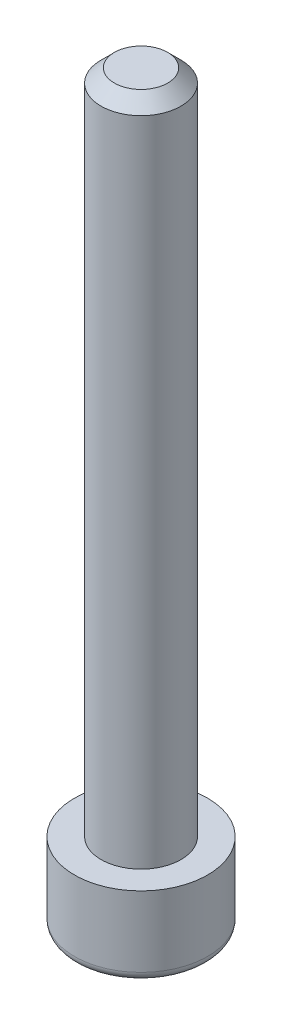
ISO-10303-21;
HEADER;
FILE_DESCRIPTION(('STEP AP214'),'2;1');
FILE_NAME('part.step','',(''),(''),'','','');
FILE_SCHEMA(('AUTOMOTIVE_DESIGN { 1 0 10303 214 1 1 1 1 }'));
ENDSEC;
DATA;
#1=APPLICATION_CONTEXT('core data for automotive mechanical design processes');
#2=APPLICATION_PROTOCOL_DEFINITION('international standard','automotive_design',2000,#1);
#3=PRODUCT_CONTEXT('',#1,'mechanical');
#4=PRODUCT('Part','Part','',(#3));
#5=PRODUCT_RELATED_PRODUCT_CATEGORY('part','',(#4));
#6=PRODUCT_DEFINITION_FORMATION('','',#4);
#7=PRODUCT_DEFINITION_CONTEXT('part definition',#1,'design');
#8=PRODUCT_DEFINITION('design','',#6,#7);
#9=PRODUCT_DEFINITION_SHAPE('','',#8);
#10=(LENGTH_UNIT() NAMED_UNIT(*) SI_UNIT(.MILLI.,.METRE.));
#11=(NAMED_UNIT(*) PLANE_ANGLE_UNIT() SI_UNIT($,.RADIAN.));
#12=(NAMED_UNIT(*) SI_UNIT($,.STERADIAN.) SOLID_ANGLE_UNIT());
#13=UNCERTAINTY_MEASURE_WITH_UNIT(LENGTH_MEASURE(1.E-05),#10,'distance_accuracy_value','');
#14=(GEOMETRIC_REPRESENTATION_CONTEXT(3) GLOBAL_UNCERTAINTY_ASSIGNED_CONTEXT((#13)) GLOBAL_UNIT_ASSIGNED_CONTEXT((#10,
#11,#12)) REPRESENTATION_CONTEXT('',''));
#15=CARTESIAN_POINT('',(0.,0.,0.));
#16=DIRECTION('',(0.,0.,1.));
#17=DIRECTION('',(1.,0.,0.));
#18=AXIS2_PLACEMENT_3D('',#15,#16,#17);
#19=CARTESIAN_POINT('',(-72.7535910764719,-1007.55662432703,-48.612395389216));
#20=DIRECTION('',(0.,-1.,0.));
#21=DIRECTION('',(-0.831469612302538,0.,-0.555570233019613));
#22=AXIS2_PLACEMENT_3D('',#19,#20,#21);
#23=CONICAL_SURFACE('',#22,1732.05080756888,1.0471975511966);
#24=CARTESIAN_POINT('',(-72.753591076472,-7.55662432702594,-48.612395389216));
#25=VERTEX_POINT('',#24);
#26=VERTEX_LOOP('',#25);
#27=FACE_BOUND('',#26,.T.);
#28=CARTESIAN_POINT('',(-72.753591076472,-9.,-48.612395389216));
#29=DIRECTION('',(0.,-1.,0.));
#30=DIRECTION('',(0.555570233019608,0.,-0.831469612302541));
#31=AXIS2_PLACEMENT_3D('',#28,#29,#30);
#32=CIRCLE('',#31,2.49999999999545);
#33=CARTESIAN_POINT('',(-71.364665493923,-9.,-50.6910694199724));
#34=VERTEX_POINT('',#33);
#35=CARTESIAN_POINT('',(-70.2589437683755,-9.,-48.4488875661406));
#36=VERTEX_POINT('',#35);
#37=EDGE_CURVE('E96',#34,#36,#32,.T.);
#38=ORIENTED_EDGE('',*,*,#37,.T.);
#39=CARTESIAN_POINT('',(-72.753591076472,-9.,-48.612395389216));
#40=DIRECTION('',(0.,-1.,0.));
#41=DIRECTION('',(0.997858923238602,0.,0.0654031292301674));
#42=AXIS2_PLACEMENT_3D('',#39,#40,#41);
#43=CIRCLE('',#42,2.49999999999545);
#44=CARTESIAN_POINT('',(-71.6478693509246,-9.,-46.3702135353843));
#45=VERTEX_POINT('',#44);
#46=EDGE_CURVE('E99',#36,#45,#43,.T.);
#47=ORIENTED_EDGE('',*,*,#46,.T.);
#48=CARTESIAN_POINT('',(-72.753591076472,-9.,-48.612395389216));
#49=DIRECTION('',(0.,-1.,0.));
#50=DIRECTION('',(0.442288690218982,0.,0.896872741532698));
#51=AXIS2_PLACEMENT_3D('',#48,#49,#50);
#52=CIRCLE('',#51,2.49999999999545);
#53=CARTESIAN_POINT('',(-74.1425166590211,-9.,-46.5337213584597));
#54=VERTEX_POINT('',#53);
#55=EDGE_CURVE('E116',#45,#54,#52,.T.);
#56=ORIENTED_EDGE('',*,*,#55,.T.);
#57=CARTESIAN_POINT('',(-72.753591076472,-9.,-48.612395389216));
#58=DIRECTION('',(0.,-1.,0.));
#59=DIRECTION('',(-0.555570233019625,0.,0.83146961230253));
#60=AXIS2_PLACEMENT_3D('',#57,#58,#59);
#61=CIRCLE('',#60,2.49999999999545);
#62=CARTESIAN_POINT('',(-75.2482383845686,-9.,-48.7759032122914));
#63=VERTEX_POINT('',#62);
#64=EDGE_CURVE('E122',#54,#63,#61,.T.);
#65=ORIENTED_EDGE('',*,*,#64,.T.);
#66=CARTESIAN_POINT('',(-72.753591076472,-9.,-48.612395389216));
#67=DIRECTION('',(0.,-1.,0.));
#68=DIRECTION('',(-0.997858923238603,0.,-0.0654031292301491));
#69=AXIS2_PLACEMENT_3D('',#66,#67,#68);
#70=CIRCLE('',#69,2.49999999999545);
#71=CARTESIAN_POINT('',(-73.8593128020195,-9.,-50.8545772430478));
#72=VERTEX_POINT('',#71);
#73=EDGE_CURVE('E134',#63,#72,#70,.T.);
#74=ORIENTED_EDGE('',*,*,#73,.T.);
#75=CARTESIAN_POINT('',(-72.753591076472,-9.,-48.612395389216));
#76=DIRECTION('',(0.,-1.,0.));
#77=DIRECTION('',(-0.442288690218982,0.,-0.896872741532698));
#78=AXIS2_PLACEMENT_3D('',#75,#76,#77);
#79=CIRCLE('',#78,2.49999999999545);
#80=EDGE_CURVE('E103',#72,#34,#79,.T.);
#81=ORIENTED_EDGE('',*,*,#80,.T.);
#82=EDGE_LOOP('',(#38,#47,#56,#65,#74,#81));
#83=FACE_BOUND('',#82,.T.);
#84=ADVANCED_FACE('F17',(#27,#83),#23,.F.);
#85=CARTESIAN_POINT('',(-72.753591076472,-9.,-48.612395389216));
#86=DIRECTION('',(0.,-1.,0.));
#87=DIRECTION('',(-0.831469612302538,0.,-0.555570233019613));
#88=AXIS2_PLACEMENT_3D('',#85,#86,#87);
#89=PLANE('',#88);
#90=DIRECTION('',(0.831469612302537,0.,0.555570233019615));
#91=VECTOR('',#90,1.);
#92=CARTESIAN_POINT('',(-71.364665493923,-9.,-50.6910694199724));
#93=LINE('',#92,#91);
#94=CARTESIAN_POINT('',(-70.1645424827084,-9.,-49.8891728610033));
#95=VERTEX_POINT('',#94);
#96=EDGE_CURVE('E143',#34,#95,#93,.T.);
#97=ORIENTED_EDGE('',*,*,#96,.T.);
#98=DIRECTION('',(-0.0654031292301584,0.,0.997858923238603));
#99=VECTOR('',#98,1.);
#100=CARTESIAN_POINT('',(-70.1645424827084,-9.,-49.8891728610033));
#101=LINE('',#100,#99);
#102=EDGE_CURVE('E148',#95,#36,#101,.T.);
#103=ORIENTED_EDGE('',*,*,#102,.T.);
#104=ORIENTED_EDGE('',*,*,#37,.F.);
#105=EDGE_LOOP('',(#97,#103,#104));
#106=FACE_BOUND('',#105,.T.);
#107=ADVANCED_FACE('F90',(#106),#89,.T.);
#108=DIRECTION('',(-0.0654031292301572,0.,0.997858923238603));
#109=VECTOR('',#108,1.);
#110=CARTESIAN_POINT('',(-70.2589437683756,-9.,-48.4488875661406));
#111=LINE('',#110,#109);
#112=CARTESIAN_POINT('',(-70.3533450540427,-9.,-47.0086022712779));
#113=VERTEX_POINT('',#112);
#114=EDGE_CURVE('E113',#36,#113,#111,.T.);
#115=ORIENTED_EDGE('',*,*,#114,.T.);
#116=DIRECTION('',(-0.896872741532695,0.,0.442288690218988));
#117=VECTOR('',#116,1.);
#118=CARTESIAN_POINT('',(-70.3533450540427,-9.,-47.0086022712779));
#119=LINE('',#118,#117);
#120=EDGE_CURVE('E114',#113,#45,#119,.T.);
#121=ORIENTED_EDGE('',*,*,#120,.T.);
#122=ORIENTED_EDGE('',*,*,#46,.F.);
#123=EDGE_LOOP('',(#115,#121,#122));
#124=FACE_BOUND('',#123,.T.);
#125=ADVANCED_FACE('F112',(#124),#89,.T.);
#126=DIRECTION('',(-0.896872741532693,0.,0.442288690218992));
#127=VECTOR('',#126,1.);
#128=CARTESIAN_POINT('',(-71.6478693509246,-9.,-46.3702135353842));
#129=LINE('',#128,#127);
#130=CARTESIAN_POINT('',(-72.9423936478064,-9.,-45.7318247994906));
#131=VERTEX_POINT('',#130);
#132=EDGE_CURVE('E161',#45,#131,#129,.T.);
#133=ORIENTED_EDGE('',*,*,#132,.T.);
#134=DIRECTION('',(-0.831469612302538,0.,-0.555570233019613));
#135=VECTOR('',#134,1.);
#136=CARTESIAN_POINT('',(-72.9423936478064,-9.,-45.7318247994906));
#137=LINE('',#136,#135);
#138=EDGE_CURVE('E167',#131,#54,#137,.T.);
#139=ORIENTED_EDGE('',*,*,#138,.T.);
#140=ORIENTED_EDGE('',*,*,#55,.F.);
#141=EDGE_LOOP('',(#133,#139,#140));
#142=FACE_BOUND('',#141,.T.);
#143=ADVANCED_FACE('F357',(#142),#89,.T.);
#144=DIRECTION('',(-0.831469612302539,0.,-0.555570233019611));
#145=VECTOR('',#144,1.);
#146=CARTESIAN_POINT('',(-74.1425166590211,-9.,-46.5337213584597));
#147=LINE('',#146,#145);
#148=CARTESIAN_POINT('',(-75.3426396702357,-9.,-47.3356179174287));
#149=VERTEX_POINT('',#148);
#150=EDGE_CURVE('E173',#54,#149,#147,.T.);
#151=ORIENTED_EDGE('',*,*,#150,.T.);
#152=DIRECTION('',(0.0654031292301578,0.,-0.997858923238603));
#153=VECTOR('',#152,1.);
#154=CARTESIAN_POINT('',(-75.3426396702357,-9.,-47.3356179174287));
#155=LINE('',#154,#153);
#156=EDGE_CURVE('E179',#149,#63,#155,.T.);
#157=ORIENTED_EDGE('',*,*,#156,.T.);
#158=ORIENTED_EDGE('',*,*,#64,.F.);
#159=EDGE_LOOP('',(#151,#157,#158));
#160=FACE_BOUND('',#159,.T.);
#161=ADVANCED_FACE('F364',(#160),#89,.T.);
#162=DIRECTION('',(0.0654031292301578,0.,-0.997858923238603));
#163=VECTOR('',#162,1.);
#164=CARTESIAN_POINT('',(-75.2482383845685,-9.,-48.7759032122914));
#165=LINE('',#164,#163);
#166=CARTESIAN_POINT('',(-75.1538370989014,-9.,-50.2161885071541));
#167=VERTEX_POINT('',#166);
#168=EDGE_CURVE('E185',#63,#167,#165,.T.);
#169=ORIENTED_EDGE('',*,*,#168,.T.);
#170=DIRECTION('',(0.896872741532695,0.,-0.442288690218989));
#171=VECTOR('',#170,1.);
#172=CARTESIAN_POINT('',(-75.1538370989014,-9.,-50.2161885071541));
#173=LINE('',#172,#171);
#174=EDGE_CURVE('E191',#167,#72,#173,.T.);
#175=ORIENTED_EDGE('',*,*,#174,.T.);
#176=ORIENTED_EDGE('',*,*,#73,.F.);
#177=EDGE_LOOP('',(#169,#175,#176));
#178=FACE_BOUND('',#177,.T.);
#179=ADVANCED_FACE('F359',(#178),#89,.T.);
#180=DIRECTION('',(0.896872741532693,0.,-0.442288690218992));
#181=VECTOR('',#180,1.);
#182=CARTESIAN_POINT('',(-73.8593128020195,-9.,-50.8545772430478));
#183=LINE('',#182,#181);
#184=CARTESIAN_POINT('',(-72.5647885051377,-9.,-51.4929659789414));
#185=VERTEX_POINT('',#184);
#186=EDGE_CURVE('E197',#72,#185,#183,.T.);
#187=ORIENTED_EDGE('',*,*,#186,.T.);
#188=DIRECTION('',(0.831469612302538,0.,0.555570233019613));
#189=VECTOR('',#188,1.);
#190=CARTESIAN_POINT('',(-72.5647885051377,-9.,-51.4929659789414));
#191=LINE('',#190,#189);
#192=EDGE_CURVE('E203',#185,#34,#191,.T.);
#193=ORIENTED_EDGE('',*,*,#192,.T.);
#194=ORIENTED_EDGE('',*,*,#80,.F.);
#195=EDGE_LOOP('',(#187,#193,#194));
#196=FACE_BOUND('',#195,.T.);
#197=ADVANCED_FACE('F351',(#196),#89,.T.);
#198=CARTESIAN_POINT('',(-72.5647885051377,-9.,-51.4929659789414));
#199=DIRECTION('',(0.555570233019613,0.,-0.831469612302538));
#200=DIRECTION('',(0.831469612302538,0.,0.555570233019613));
#201=AXIS2_PLACEMENT_3D('',#198,#199,#200);
#202=PLANE('',#201);
#203=ORIENTED_EDGE('',*,*,#192,.F.);
#204=DIRECTION('',(0.,-1.,0.));
#205=VECTOR('',#204,1.);
#206=CARTESIAN_POINT('',(-72.5647885051377,-9.,-51.4929659789414));
#207=LINE('',#206,#205);
#208=CARTESIAN_POINT('',(-72.5647885051377,-14.,-51.4929659789414));
#209=VERTEX_POINT('',#208);
#210=EDGE_CURVE('E209',#185,#209,#207,.T.);
#211=ORIENTED_EDGE('',*,*,#210,.T.);
#212=DIRECTION('',(0.831469612302538,0.,0.555570233019614));
#213=VECTOR('',#212,1.);
#214=CARTESIAN_POINT('',(-72.5647885051377,-14.,-51.4929659789414));
#215=LINE('',#214,#213);
#216=CARTESIAN_POINT('',(-70.1645424827084,-14.,-49.8891728610033));
#217=VERTEX_POINT('',#216);
#218=EDGE_CURVE('E215',#209,#217,#215,.T.);
#219=ORIENTED_EDGE('',*,*,#218,.T.);
#220=DIRECTION('',(0.,-1.,0.));
#221=VECTOR('',#220,1.);
#222=CARTESIAN_POINT('',(-70.1645424827084,-9.,-49.8891728610033));
#223=LINE('',#222,#221);
#224=EDGE_CURVE('E221',#95,#217,#223,.T.);
#225=ORIENTED_EDGE('',*,*,#224,.F.);
#226=ORIENTED_EDGE('',*,*,#96,.F.);
#227=EDGE_LOOP('',(#203,#211,#219,#225,#226));
#228=FACE_BOUND('',#227,.T.);
#229=ADVANCED_FACE('F347',(#228),#202,.F.);
#230=CARTESIAN_POINT('',(-70.1645424827084,-9.,-49.8891728610033));
#231=DIRECTION('',(0.997858923238603,0.,0.0654031292301556));
#232=DIRECTION('',(-0.0654031292301556,0.,0.997858923238603));
#233=AXIS2_PLACEMENT_3D('',#230,#231,#232);
#234=PLANE('',#233);
#235=ORIENTED_EDGE('',*,*,#102,.F.);
#236=ORIENTED_EDGE('',*,*,#224,.T.);
#237=DIRECTION('',(-0.0654031292301578,0.,0.997858923238603));
#238=VECTOR('',#237,1.);
#239=CARTESIAN_POINT('',(-70.1645424827084,-14.,-49.8891728610033));
#240=LINE('',#239,#238);
#241=CARTESIAN_POINT('',(-70.3533450540427,-14.,-47.0086022712779));
#242=VERTEX_POINT('',#241);
#243=EDGE_CURVE('E227',#217,#242,#240,.T.);
#244=ORIENTED_EDGE('',*,*,#243,.T.);
#245=DIRECTION('',(0.,-1.,0.));
#246=VECTOR('',#245,1.);
#247=CARTESIAN_POINT('',(-70.3533450540427,-9.,-47.0086022712779));
#248=LINE('',#247,#246);
#249=EDGE_CURVE('E233',#113,#242,#248,.T.);
#250=ORIENTED_EDGE('',*,*,#249,.F.);
#251=ORIENTED_EDGE('',*,*,#114,.F.);
#252=EDGE_LOOP('',(#235,#236,#244,#250,#251));
#253=FACE_BOUND('',#252,.T.);
#254=ADVANCED_FACE('F343',(#253),#234,.F.);
#255=CARTESIAN_POINT('',(-70.3533450540427,-9.,-47.0086022712779));
#256=DIRECTION('',(0.44228869021899,0.,0.896872741532694));
#257=DIRECTION('',(-0.896872741532694,0.,0.44228869021899));
#258=AXIS2_PLACEMENT_3D('',#255,#256,#257);
#259=PLANE('',#258);
#260=ORIENTED_EDGE('',*,*,#120,.F.);
#261=ORIENTED_EDGE('',*,*,#249,.T.);
#262=DIRECTION('',(-0.896872741532694,0.,0.44228869021899));
#263=VECTOR('',#262,1.);
#264=CARTESIAN_POINT('',(-70.3533450540427,-14.,-47.0086022712779));
#265=LINE('',#264,#263);
#266=CARTESIAN_POINT('',(-72.9423936478064,-14.,-45.7318247994906));
#267=VERTEX_POINT('',#266);
#268=EDGE_CURVE('E239',#242,#267,#265,.T.);
#269=ORIENTED_EDGE('',*,*,#268,.T.);
#270=DIRECTION('',(0.,-1.,0.));
#271=VECTOR('',#270,1.);
#272=CARTESIAN_POINT('',(-72.9423936478064,-9.,-45.7318247994906));
#273=LINE('',#272,#271);
#274=EDGE_CURVE('E245',#131,#267,#273,.T.);
#275=ORIENTED_EDGE('',*,*,#274,.F.);
#276=ORIENTED_EDGE('',*,*,#132,.F.);
#277=EDGE_LOOP('',(#260,#261,#269,#275,#276));
#278=FACE_BOUND('',#277,.T.);
#279=ADVANCED_FACE('F339',(#278),#259,.F.);
#280=CARTESIAN_POINT('',(-72.9423936478064,-9.,-45.7318247994906));
#281=DIRECTION('',(-0.555570233019613,0.,0.831469612302538));
#282=DIRECTION('',(-0.831469612302538,0.,-0.555570233019613));
#283=AXIS2_PLACEMENT_3D('',#280,#281,#282);
#284=PLANE('',#283);
#285=ORIENTED_EDGE('',*,*,#138,.F.);
#286=ORIENTED_EDGE('',*,*,#274,.T.);
#287=DIRECTION('',(-0.831469612302539,0.,-0.555570233019612));
#288=VECTOR('',#287,1.);
#289=CARTESIAN_POINT('',(-72.9423936478064,-14.,-45.7318247994906));
#290=LINE('',#289,#288);
#291=CARTESIAN_POINT('',(-75.3426396702357,-14.,-47.3356179174287));
#292=VERTEX_POINT('',#291);
#293=EDGE_CURVE('E251',#267,#292,#290,.T.);
#294=ORIENTED_EDGE('',*,*,#293,.T.);
#295=DIRECTION('',(0.,-1.,0.));
#296=VECTOR('',#295,1.);
#297=CARTESIAN_POINT('',(-75.3426396702357,-9.,-47.3356179174287));
#298=LINE('',#297,#296);
#299=EDGE_CURVE('E256',#149,#292,#298,.T.);
#300=ORIENTED_EDGE('',*,*,#299,.F.);
#301=ORIENTED_EDGE('',*,*,#150,.F.);
#302=EDGE_LOOP('',(#285,#286,#294,#300,#301));
#303=FACE_BOUND('',#302,.T.);
#304=ADVANCED_FACE('F335',(#303),#284,.F.);
#305=CARTESIAN_POINT('',(-75.3426396702357,-9.,-47.3356179174287));
#306=DIRECTION('',(-0.997858923238603,0.,-0.0654031292301556));
#307=DIRECTION('',(0.0654031292301556,0.,-0.997858923238603));
#308=AXIS2_PLACEMENT_3D('',#305,#306,#307);
#309=PLANE('',#308);
#310=ORIENTED_EDGE('',*,*,#156,.F.);
#311=ORIENTED_EDGE('',*,*,#299,.T.);
#312=DIRECTION('',(0.0654031292301578,0.,-0.997858923238603));
#313=VECTOR('',#312,1.);
#314=CARTESIAN_POINT('',(-75.3426396702357,-14.,-47.3356179174287));
#315=LINE('',#314,#313);
#316=CARTESIAN_POINT('',(-75.1538370989014,-14.,-50.2161885071541));
#317=VERTEX_POINT('',#316);
#318=EDGE_CURVE('E37',#292,#317,#315,.T.);
#319=ORIENTED_EDGE('',*,*,#318,.T.);
#320=DIRECTION('',(0.,-1.,0.));
#321=VECTOR('',#320,1.);
#322=CARTESIAN_POINT('',(-75.1538370989014,-9.,-50.2161885071541));
#323=LINE('',#322,#321);
#324=EDGE_CURVE('E266',#167,#317,#323,.T.);
#325=ORIENTED_EDGE('',*,*,#324,.F.);
#326=ORIENTED_EDGE('',*,*,#168,.F.);
#327=EDGE_LOOP('',(#310,#311,#319,#325,#326));
#328=FACE_BOUND('',#327,.T.);
#329=ADVANCED_FACE('F331',(#328),#309,.F.);
#330=CARTESIAN_POINT('',(-75.1538370989014,-9.,-50.2161885071541));
#331=DIRECTION('',(-0.44228869021899,0.,-0.896872741532694));
#332=DIRECTION('',(0.896872741532694,0.,-0.44228869021899));
#333=AXIS2_PLACEMENT_3D('',#330,#331,#332);
#334=PLANE('',#333);
#335=ORIENTED_EDGE('',*,*,#174,.F.);
#336=ORIENTED_EDGE('',*,*,#324,.T.);
#337=DIRECTION('',(0.896872741532694,0.,-0.44228869021899));
#338=VECTOR('',#337,1.);
#339=CARTESIAN_POINT('',(-75.1538370989014,-14.,-50.2161885071541));
#340=LINE('',#339,#338);
#341=EDGE_CURVE('E33',#317,#209,#340,.T.);
#342=ORIENTED_EDGE('',*,*,#341,.T.);
#343=ORIENTED_EDGE('',*,*,#210,.F.);
#344=ORIENTED_EDGE('',*,*,#186,.F.);
#345=EDGE_LOOP('',(#335,#336,#342,#343,#344));
#346=FACE_BOUND('',#345,.T.);
#347=ADVANCED_FACE('F328',(#346),#334,.F.);
#348=CARTESIAN_POINT('',(-75.1425430784564,-14.,-45.0370760563151));
#349=DIRECTION('',(0.,-1.,0.));
#350=DIRECTION('',(-0.831469612302538,0.,-0.555570233019613));
#351=AXIS2_PLACEMENT_3D('',#348,#349,#350);
#352=PLANE('',#351);
#353=ORIENTED_EDGE('',*,*,#243,.F.);
#354=ORIENTED_EDGE('',*,*,#218,.F.);
#355=ORIENTED_EDGE('',*,*,#341,.F.);
#356=ORIENTED_EDGE('',*,*,#318,.F.);
#357=ORIENTED_EDGE('',*,*,#293,.F.);
#358=ORIENTED_EDGE('',*,*,#268,.F.);
#359=EDGE_LOOP('',(#353,#354,#355,#356,#357,#358));
#360=FACE_BOUND('',#359,.T.);
#361=CARTESIAN_POINT('',(-72.753591076472,-14.,-48.612395389216));
#362=DIRECTION('',(0.,-1.,0.));
#363=DIRECTION('',(-0.831469612302539,0.,-0.555570233019612));
#364=AXIS2_PLACEMENT_3D('',#361,#362,#363);
#365=CIRCLE('',#364,4.3);
#366=CARTESIAN_POINT('',(-76.3289104093729,-14.,-51.0013473912003));
#367=VERTEX_POINT('',#366);
#368=EDGE_CURVE('E276',#367,#367,#365,.T.);
#369=ORIENTED_EDGE('',*,*,#368,.T.);
#370=EDGE_LOOP('',(#369));
#371=FACE_BOUND('',#370,.T.);
#372=ADVANCED_FACE('F324',(#360,#371),#352,.T.);
#373=CARTESIAN_POINT('',(-72.753591076472,-13.3,-48.612395389216));
#374=DIRECTION('',(0.,-1.,0.));
#375=DIRECTION('',(-0.831469612302539,0.,-0.555570233019612));
#376=AXIS2_PLACEMENT_3D('',#373,#374,#375);
#377=TOROIDAL_SURFACE('',#376,4.3,0.7);
#378=CARTESIAN_POINT('',(-72.753591076472,-13.3,-48.612395389216));
#379=DIRECTION('',(0.,-1.,0.));
#380=DIRECTION('',(-0.831469612302539,0.,-0.555570233019612));
#381=AXIS2_PLACEMENT_3D('',#378,#379,#380);
#382=CIRCLE('',#381,5.);
#383=CARTESIAN_POINT('',(-76.9109391379847,-13.3,-51.3902465543141));
#384=VERTEX_POINT('',#383);
#385=EDGE_CURVE('E282',#384,#384,#382,.T.);
#386=ORIENTED_EDGE('',*,*,#385,.T.);
#387=EDGE_LOOP('',(#386));
#388=FACE_BOUND('',#387,.T.);
#389=ORIENTED_EDGE('',*,*,#368,.F.);
#390=EDGE_LOOP('',(#389));
#391=FACE_BOUND('',#390,.T.);
#392=ADVANCED_FACE('F320',(#388,#391),#377,.T.);
#393=CARTESIAN_POINT('',(-72.753591076472,-39.6846382616373,-48.612395389216));
#394=DIRECTION('',(0.,-1.,0.));
#395=DIRECTION('',(-0.831469612302539,0.,-0.555570233019612));
#396=AXIS2_PLACEMENT_3D('',#393,#394,#395);
#397=CYLINDRICAL_SURFACE('',#396,5.);
#398=CARTESIAN_POINT('',(-72.753591076472,-8.,-48.612395389216));
#399=DIRECTION('',(0.,-1.,0.));
#400=DIRECTION('',(-0.831469612302539,0.,-0.555570233019612));
#401=AXIS2_PLACEMENT_3D('',#398,#399,#400);
#402=CIRCLE('',#401,5.);
#403=CARTESIAN_POINT('',(-76.9109391379847,-8.,-51.3902465543141));
#404=VERTEX_POINT('',#403);
#405=EDGE_CURVE('E286',#404,#404,#402,.T.);
#406=ORIENTED_EDGE('',*,*,#405,.T.);
#407=EDGE_LOOP('',(#406));
#408=FACE_BOUND('',#407,.T.);
#409=ORIENTED_EDGE('',*,*,#385,.F.);
#410=EDGE_LOOP('',(#409));
#411=FACE_BOUND('',#410,.T.);
#412=ADVANCED_FACE('F316',(#408,#411),#397,.T.);
#413=CARTESIAN_POINT('',(-75.5314422415701,-8.,-44.4550473277033));
#414=DIRECTION('',(0.,1.,0.));
#415=DIRECTION('',(0.831469612302538,0.,0.555570233019613));
#416=AXIS2_PLACEMENT_3D('',#413,#414,#415);
#417=PLANE('',#416);
#418=CARTESIAN_POINT('',(-72.753591076472,-8.,-48.612395389216));
#419=DIRECTION('',(0.,-1.,0.));
#420=DIRECTION('',(-0.831469612302539,0.,-0.555570233019612));
#421=AXIS2_PLACEMENT_3D('',#418,#419,#420);
#422=CIRCLE('',#421,3.);
#423=CARTESIAN_POINT('',(-75.2479999133796,-8.,-50.2791060882748));
#424=VERTEX_POINT('',#423);
#425=EDGE_CURVE('E290',#424,#424,#422,.T.);
#426=ORIENTED_EDGE('',*,*,#425,.T.);
#427=EDGE_LOOP('',(#426));
#428=FACE_BOUND('',#427,.T.);
#429=ORIENTED_EDGE('',*,*,#405,.F.);
#430=EDGE_LOOP('',(#429));
#431=FACE_BOUND('',#430,.T.);
#432=ADVANCED_FACE('F311',(#428,#431),#417,.T.);
#433=CARTESIAN_POINT('',(-72.753591076472,-39.6846382616373,-48.612395389216));
#434=DIRECTION('',(0.,-1.,0.));
#435=DIRECTION('',(-0.831469612302539,0.,-0.555570233019612));
#436=AXIS2_PLACEMENT_3D('',#433,#434,#435);
#437=CYLINDRICAL_SURFACE('',#436,3.);
#438=CARTESIAN_POINT('',(-72.753591076472,41.,-48.612395389216));
#439=DIRECTION('',(0.,-1.,0.));
#440=DIRECTION('',(-0.831469612302536,0.,-0.555570233019616));
#441=AXIS2_PLACEMENT_3D('',#438,#439,#440);
#442=CIRCLE('',#441,2.99999999999998);
#443=CARTESIAN_POINT('',(-75.2479999133796,41.,-50.2791060882748));
#444=VERTEX_POINT('',#443);
#445=EDGE_CURVE('E26',#444,#444,#442,.T.);
#446=ORIENTED_EDGE('',*,*,#445,.T.);
#447=EDGE_LOOP('',(#446));
#448=FACE_BOUND('',#447,.T.);
#449=ORIENTED_EDGE('',*,*,#425,.F.);
#450=EDGE_LOOP('',(#449));
#451=FACE_BOUND('',#450,.T.);
#452=ADVANCED_FACE('F299',(#448,#451),#437,.T.);
#453=CARTESIAN_POINT('',(-72.753591076472,41.,-48.612395389216));
#454=DIRECTION('',(0.,-1.,0.));
#455=DIRECTION('',(-0.831469612302538,0.,-0.555570233019614));
#456=AXIS2_PLACEMENT_3D('',#453,#454,#455);
#457=CONICAL_SURFACE('',#456,3.,0.785398163397448);
#458=CARTESIAN_POINT('',(-72.753591076472,42.,-48.612395389216));
#459=DIRECTION('',(0.,-1.,0.));
#460=DIRECTION('',(-0.831469612302539,0.,-0.555570233019611));
#461=AXIS2_PLACEMENT_3D('',#458,#459,#460);
#462=CIRCLE('',#461,2.);
#463=CARTESIAN_POINT('',(-74.4165303010771,42.,-49.7235358552552));
#464=VERTEX_POINT('',#463);
#465=EDGE_CURVE('E11',#464,#464,#462,.T.);
#466=ORIENTED_EDGE('',*,*,#465,.T.);
#467=EDGE_LOOP('',(#466));
#468=FACE_BOUND('',#467,.T.);
#469=ORIENTED_EDGE('',*,*,#445,.F.);
#470=EDGE_LOOP('',(#469));
#471=FACE_BOUND('',#470,.T.);
#472=ADVANCED_FACE('F302',(#468,#471),#457,.T.);
#473=CARTESIAN_POINT('',(-73.8647315425113,42.,-46.949456164611));
#474=DIRECTION('',(0.,1.,0.));
#475=DIRECTION('',(0.831469612302538,0.,0.555570233019613));
#476=AXIS2_PLACEMENT_3D('',#473,#474,#475);
#477=PLANE('',#476);
#478=ORIENTED_EDGE('',*,*,#465,.F.);
#479=EDGE_LOOP('',(#478));
#480=FACE_BOUND('',#479,.T.);
#481=ADVANCED_FACE('F19',(#480),#477,.T.);
#482=CLOSED_SHELL('',(#84,#107,#125,#143,#161,#179,#197,#229,#254,#279,#304,#329,#347,#372,#392,
#412,#432,#452,#472,#481));
#483=MANIFOLD_SOLID_BREP('B1',#482);
#484=ADVANCED_BREP_SHAPE_REPRESENTATION('',(#18,#483),#14);
#485=SHAPE_DEFINITION_REPRESENTATION(#9,#484);
ENDSEC;
END-ISO-10303-21;
